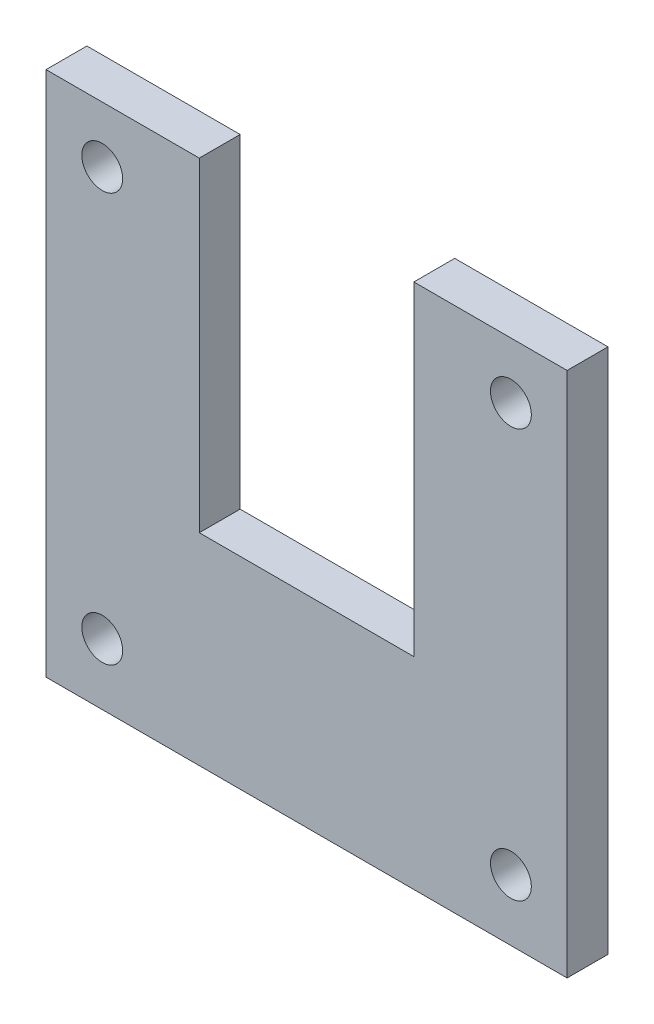
ISO-10303-21;
HEADER;
FILE_DESCRIPTION(('STEP AP214'),'2;1');
FILE_NAME('part.step','',(''),(''),'','','');
FILE_SCHEMA(('AUTOMOTIVE_DESIGN { 1 0 10303 214 1 1 1 1 }'));
ENDSEC;
DATA;
#1=APPLICATION_CONTEXT('core data for automotive mechanical design processes');
#2=APPLICATION_PROTOCOL_DEFINITION('international standard','automotive_design',2000,#1);
#3=PRODUCT_CONTEXT('',#1,'mechanical');
#4=PRODUCT('Part','Part','',(#3));
#5=PRODUCT_RELATED_PRODUCT_CATEGORY('part','',(#4));
#6=PRODUCT_DEFINITION_FORMATION('','',#4);
#7=PRODUCT_DEFINITION_CONTEXT('part definition',#1,'design');
#8=PRODUCT_DEFINITION('design','',#6,#7);
#9=PRODUCT_DEFINITION_SHAPE('','',#8);
#10=(LENGTH_UNIT() NAMED_UNIT(*) SI_UNIT(.MILLI.,.METRE.));
#11=(NAMED_UNIT(*) PLANE_ANGLE_UNIT() SI_UNIT($,.RADIAN.));
#12=(NAMED_UNIT(*) SI_UNIT($,.STERADIAN.) SOLID_ANGLE_UNIT());
#13=UNCERTAINTY_MEASURE_WITH_UNIT(LENGTH_MEASURE(1.E-05),#10,'distance_accuracy_value','');
#14=(GEOMETRIC_REPRESENTATION_CONTEXT(3) GLOBAL_UNCERTAINTY_ASSIGNED_CONTEXT((#13)) GLOBAL_UNIT_ASSIGNED_CONTEXT((#10,
#11,#12)) REPRESENTATION_CONTEXT('',''));
#15=CARTESIAN_POINT('',(0.,0.,0.));
#16=DIRECTION('',(0.,0.,1.));
#17=DIRECTION('',(1.,0.,0.));
#18=AXIS2_PLACEMENT_3D('',#15,#16,#17);
#19=CARTESIAN_POINT('',(-24.2234042553192,19.554868644798,4.));
#20=DIRECTION('',(0.,-1.,0.));
#21=DIRECTION('',(0.,0.,-1.));
#22=AXIS2_PLACEMENT_3D('',#19,#20,#21);
#23=PLANE('',#22);
#24=DIRECTION('',(-1.,0.,0.));
#25=VECTOR('',#24,1.);
#26=CARTESIAN_POINT('',(-24.2234042553192,19.554868644798,4.));
#27=LINE('',#26,#25);
#28=CARTESIAN_POINT('',(-9.22340425531916,19.554868644798,4.));
#29=VERTEX_POINT('',#28);
#30=CARTESIAN_POINT('',(-24.2234042553192,19.554868644798,4.));
#31=VERTEX_POINT('',#30);
#32=EDGE_CURVE('E86',#29,#31,#27,.T.);
#33=ORIENTED_EDGE('',*,*,#32,.F.);
#34=DIRECTION('',(0.,0.,1.));
#35=VECTOR('',#34,1.);
#36=CARTESIAN_POINT('',(-9.22340425531916,19.554868644798,0.));
#37=LINE('',#36,#35);
#38=CARTESIAN_POINT('',(-9.22340425531916,19.554868644798,0.));
#39=VERTEX_POINT('',#38);
#40=EDGE_CURVE('E140',#39,#29,#37,.T.);
#41=ORIENTED_EDGE('',*,*,#40,.F.);
#42=DIRECTION('',(-1.,0.,0.));
#43=VECTOR('',#42,1.);
#44=CARTESIAN_POINT('',(-24.2234042553192,19.554868644798,0.));
#45=LINE('',#44,#43);
#46=CARTESIAN_POINT('',(-24.2234042553192,19.554868644798,0.));
#47=VERTEX_POINT('',#46);
#48=EDGE_CURVE('E132',#39,#47,#45,.T.);
#49=ORIENTED_EDGE('',*,*,#48,.T.);
#50=DIRECTION('',(0.,0.,-1.));
#51=VECTOR('',#50,1.);
#52=CARTESIAN_POINT('',(-24.2234042553192,19.554868644798,4.));
#53=LINE('',#52,#51);
#54=EDGE_CURVE('E11',#31,#47,#53,.T.);
#55=ORIENTED_EDGE('',*,*,#54,.F.);
#56=EDGE_LOOP('',(#33,#41,#49,#55));
#57=FACE_BOUND('',#56,.T.);
#58=ADVANCED_FACE('F35',(#57),#23,.F.);
#59=CARTESIAN_POINT('',(0.,0.,4.));
#60=DIRECTION('',(0.,0.,-1.));
#61=DIRECTION('',(-1.,0.,0.));
#62=AXIS2_PLACEMENT_3D('',#59,#60,#61);
#63=PLANE('',#62);
#64=DIRECTION('',(1.,0.,0.));
#65=VECTOR('',#64,1.);
#66=CARTESIAN_POINT('',(-9.22340425531916,-12.2021276595745,4.));
#67=LINE('',#66,#65);
#68=CARTESIAN_POINT('',(-9.22340425531916,-12.2021276595745,4.));
#69=VERTEX_POINT('',#68);
#70=CARTESIAN_POINT('',(11.7765957446809,-12.2021276595745,4.));
#71=VERTEX_POINT('',#70);
#72=EDGE_CURVE('E134',#69,#71,#67,.T.);
#73=ORIENTED_EDGE('',*,*,#72,.F.);
#74=DIRECTION('',(0.,-1.,0.));
#75=VECTOR('',#74,1.);
#76=CARTESIAN_POINT('',(-9.22340425531916,19.554868644798,4.));
#77=LINE('',#76,#75);
#78=EDGE_CURVE('E114',#29,#69,#77,.T.);
#79=ORIENTED_EDGE('',*,*,#78,.F.);
#80=ORIENTED_EDGE('',*,*,#32,.T.);
#81=DIRECTION('',(0.,-1.,0.));
#82=VECTOR('',#81,1.);
#83=CARTESIAN_POINT('',(-24.2234042553192,19.554868644798,4.));
#84=LINE('',#83,#82);
#85=CARTESIAN_POINT('',(-24.2234042553192,-31.945131355202,4.));
#86=VERTEX_POINT('',#85);
#87=EDGE_CURVE('E171',#31,#86,#84,.T.);
#88=ORIENTED_EDGE('',*,*,#87,.T.);
#89=DIRECTION('',(1.,0.,0.));
#90=VECTOR('',#89,1.);
#91=CARTESIAN_POINT('',(-24.2234042553192,-31.945131355202,4.));
#92=LINE('',#91,#90);
#93=CARTESIAN_POINT('',(26.7765957446808,-31.945131355202,4.));
#94=VERTEX_POINT('',#93);
#95=EDGE_CURVE('E173',#86,#94,#92,.T.);
#96=ORIENTED_EDGE('',*,*,#95,.T.);
#97=DIRECTION('',(0.,1.,0.));
#98=VECTOR('',#97,1.);
#99=CARTESIAN_POINT('',(26.7765957446808,-31.945131355202,4.));
#100=LINE('',#99,#98);
#101=CARTESIAN_POINT('',(26.7765957446808,19.554868644798,4.));
#102=VERTEX_POINT('',#101);
#103=EDGE_CURVE('E59',#94,#102,#100,.T.);
#104=ORIENTED_EDGE('',*,*,#103,.T.);
#105=CARTESIAN_POINT('',(11.7765957446808,19.554868644798,4.));
#106=VERTEX_POINT('',#105);
#107=EDGE_CURVE('E169',#102,#106,#27,.T.);
#108=ORIENTED_EDGE('',*,*,#107,.T.);
#109=DIRECTION('',(0.,1.,0.));
#110=VECTOR('',#109,1.);
#111=CARTESIAN_POINT('',(11.7765957446808,19.554868644798,4.));
#112=LINE('',#111,#110);
#113=EDGE_CURVE('E50',#71,#106,#112,.T.);
#114=ORIENTED_EDGE('',*,*,#113,.F.);
#115=EDGE_LOOP('',(#73,#79,#80,#88,#96,#104,#108,#114));
#116=FACE_BOUND('',#115,.T.);
#117=CARTESIAN_POINT('',(-18.7234042553192,-25.945131355202,4.));
#118=DIRECTION('',(0.,0.,1.));
#119=DIRECTION('',(1.,0.,0.));
#120=AXIS2_PLACEMENT_3D('',#117,#118,#119);
#121=CIRCLE('',#120,2.);
#122=CARTESIAN_POINT('',(-16.7234042553192,-25.945131355202,4.));
#123=VERTEX_POINT('',#122);
#124=EDGE_CURVE('E164',#123,#123,#121,.T.);
#125=ORIENTED_EDGE('',*,*,#124,.F.);
#126=EDGE_LOOP('',(#125));
#127=FACE_BOUND('',#126,.T.);
#128=CARTESIAN_POINT('',(21.2765957446808,-25.945131355202,4.));
#129=DIRECTION('',(0.,0.,1.));
#130=DIRECTION('',(1.,0.,0.));
#131=AXIS2_PLACEMENT_3D('',#128,#129,#130);
#132=CIRCLE('',#131,2.);
#133=CARTESIAN_POINT('',(23.2765957446808,-25.945131355202,4.));
#134=VERTEX_POINT('',#133);
#135=EDGE_CURVE('E158',#134,#134,#132,.T.);
#136=ORIENTED_EDGE('',*,*,#135,.F.);
#137=EDGE_LOOP('',(#136));
#138=FACE_BOUND('',#137,.T.);
#139=CARTESIAN_POINT('',(-18.7234042553192,14.054868644798,4.));
#140=DIRECTION('',(0.,0.,1.));
#141=DIRECTION('',(1.,0.,0.));
#142=AXIS2_PLACEMENT_3D('',#139,#140,#141);
#143=CIRCLE('',#142,2.);
#144=CARTESIAN_POINT('',(-16.7234042553192,14.054868644798,4.));
#145=VERTEX_POINT('',#144);
#146=EDGE_CURVE('E152',#145,#145,#143,.T.);
#147=ORIENTED_EDGE('',*,*,#146,.F.);
#148=EDGE_LOOP('',(#147));
#149=FACE_BOUND('',#148,.T.);
#150=CARTESIAN_POINT('',(21.2765957446808,14.054868644798,4.));
#151=DIRECTION('',(0.,0.,1.));
#152=DIRECTION('',(1.,0.,0.));
#153=AXIS2_PLACEMENT_3D('',#150,#151,#152);
#154=CIRCLE('',#153,2.00000000000001);
#155=CARTESIAN_POINT('',(23.2765957446808,14.054868644798,4.));
#156=VERTEX_POINT('',#155);
#157=EDGE_CURVE('E146',#156,#156,#154,.T.);
#158=ORIENTED_EDGE('',*,*,#157,.F.);
#159=EDGE_LOOP('',(#158));
#160=FACE_BOUND('',#159,.T.);
#161=ADVANCED_FACE('F214',(#116,#127,#138,#149,#160),#63,.F.);
#162=CARTESIAN_POINT('',(0.,0.,0.));
#163=DIRECTION('',(0.,0.,-1.));
#164=DIRECTION('',(-1.,0.,0.));
#165=AXIS2_PLACEMENT_3D('',#162,#163,#164);
#166=PLANE('',#165);
#167=DIRECTION('',(0.,-1.,0.));
#168=VECTOR('',#167,1.);
#169=CARTESIAN_POINT('',(-9.22340425531916,19.554868644798,0.));
#170=LINE('',#169,#168);
#171=CARTESIAN_POINT('',(-9.22340425531916,-12.2021276595745,0.));
#172=VERTEX_POINT('',#171);
#173=EDGE_CURVE('E112',#39,#172,#170,.T.);
#174=ORIENTED_EDGE('',*,*,#173,.T.);
#175=DIRECTION('',(1.,0.,0.));
#176=VECTOR('',#175,1.);
#177=CARTESIAN_POINT('',(-9.22340425531916,-12.2021276595745,0.));
#178=LINE('',#177,#176);
#179=CARTESIAN_POINT('',(11.7765957446809,-12.2021276595745,0.));
#180=VERTEX_POINT('',#179);
#181=EDGE_CURVE('E122',#172,#180,#178,.T.);
#182=ORIENTED_EDGE('',*,*,#181,.T.);
#183=DIRECTION('',(0.,1.,0.));
#184=VECTOR('',#183,1.);
#185=CARTESIAN_POINT('',(11.7765957446808,19.554868644798,0.));
#186=LINE('',#185,#184);
#187=CARTESIAN_POINT('',(11.7765957446808,19.554868644798,0.));
#188=VERTEX_POINT('',#187);
#189=EDGE_CURVE('E119',#180,#188,#186,.T.);
#190=ORIENTED_EDGE('',*,*,#189,.T.);
#191=CARTESIAN_POINT('',(26.7765957446808,19.554868644798,0.));
#192=VERTEX_POINT('',#191);
#193=EDGE_CURVE('E177',#192,#188,#45,.T.);
#194=ORIENTED_EDGE('',*,*,#193,.F.);
#195=DIRECTION('',(0.,1.,0.));
#196=VECTOR('',#195,1.);
#197=CARTESIAN_POINT('',(26.7765957446808,19.554868644798,0.));
#198=LINE('',#197,#196);
#199=CARTESIAN_POINT('',(26.7765957446808,-31.945131355202,0.));
#200=VERTEX_POINT('',#199);
#201=EDGE_CURVE('E79',#200,#192,#198,.T.);
#202=ORIENTED_EDGE('',*,*,#201,.F.);
#203=DIRECTION('',(1.,0.,0.));
#204=VECTOR('',#203,1.);
#205=CARTESIAN_POINT('',(-24.2234042553192,-31.945131355202,0.));
#206=LINE('',#205,#204);
#207=CARTESIAN_POINT('',(-24.2234042553192,-31.945131355202,0.));
#208=VERTEX_POINT('',#207);
#209=EDGE_CURVE('E182',#208,#200,#206,.T.);
#210=ORIENTED_EDGE('',*,*,#209,.F.);
#211=DIRECTION('',(0.,-1.,0.));
#212=VECTOR('',#211,1.);
#213=CARTESIAN_POINT('',(-24.2234042553192,-31.445131355202,0.));
#214=LINE('',#213,#212);
#215=EDGE_CURVE('E180',#47,#208,#214,.T.);
#216=ORIENTED_EDGE('',*,*,#215,.F.);
#217=ORIENTED_EDGE('',*,*,#48,.F.);
#218=EDGE_LOOP('',(#174,#182,#190,#194,#202,#210,#216,#217));
#219=FACE_BOUND('',#218,.T.);
#220=CARTESIAN_POINT('',(-18.7234042553192,14.054868644798,0.));
#221=DIRECTION('',(0.,0.,1.));
#222=DIRECTION('',(1.,0.,0.));
#223=AXIS2_PLACEMENT_3D('',#220,#221,#222);
#224=CIRCLE('',#223,2.);
#225=CARTESIAN_POINT('',(-16.7234042553192,14.054868644798,0.));
#226=VERTEX_POINT('',#225);
#227=EDGE_CURVE('E149',#226,#226,#224,.T.);
#228=ORIENTED_EDGE('',*,*,#227,.T.);
#229=EDGE_LOOP('',(#228));
#230=FACE_BOUND('',#229,.T.);
#231=CARTESIAN_POINT('',(-18.7234042553192,-25.945131355202,0.));
#232=DIRECTION('',(0.,0.,1.));
#233=DIRECTION('',(1.,0.,0.));
#234=AXIS2_PLACEMENT_3D('',#231,#232,#233);
#235=CIRCLE('',#234,2.);
#236=CARTESIAN_POINT('',(-16.7234042553192,-25.945131355202,0.));
#237=VERTEX_POINT('',#236);
#238=EDGE_CURVE('E161',#237,#237,#235,.T.);
#239=ORIENTED_EDGE('',*,*,#238,.T.);
#240=EDGE_LOOP('',(#239));
#241=FACE_BOUND('',#240,.T.);
#242=CARTESIAN_POINT('',(21.2765957446808,-25.945131355202,0.));
#243=DIRECTION('',(0.,0.,1.));
#244=DIRECTION('',(1.,0.,0.));
#245=AXIS2_PLACEMENT_3D('',#242,#243,#244);
#246=CIRCLE('',#245,2.);
#247=CARTESIAN_POINT('',(23.2765957446808,-25.945131355202,0.));
#248=VERTEX_POINT('',#247);
#249=EDGE_CURVE('E155',#248,#248,#246,.T.);
#250=ORIENTED_EDGE('',*,*,#249,.T.);
#251=EDGE_LOOP('',(#250));
#252=FACE_BOUND('',#251,.T.);
#253=CARTESIAN_POINT('',(21.2765957446808,14.054868644798,0.));
#254=DIRECTION('',(0.,0.,1.));
#255=DIRECTION('',(1.,0.,0.));
#256=AXIS2_PLACEMENT_3D('',#253,#254,#255);
#257=CIRCLE('',#256,2.00000000000001);
#258=CARTESIAN_POINT('',(23.2765957446808,14.054868644798,0.));
#259=VERTEX_POINT('',#258);
#260=EDGE_CURVE('E142',#259,#259,#257,.T.);
#261=ORIENTED_EDGE('',*,*,#260,.T.);
#262=EDGE_LOOP('',(#261));
#263=FACE_BOUND('',#262,.T.);
#264=ADVANCED_FACE('F129',(#219,#230,#241,#252,#263),#166,.T.);
#265=ORIENTED_EDGE('',*,*,#193,.T.);
#266=DIRECTION('',(0.,0.,1.));
#267=VECTOR('',#266,1.);
#268=CARTESIAN_POINT('',(11.7765957446808,19.554868644798,0.));
#269=LINE('',#268,#267);
#270=EDGE_CURVE('E143',#188,#106,#269,.T.);
#271=ORIENTED_EDGE('',*,*,#270,.T.);
#272=ORIENTED_EDGE('',*,*,#107,.F.);
#273=DIRECTION('',(0.,0.,-1.));
#274=VECTOR('',#273,1.);
#275=CARTESIAN_POINT('',(26.7765957446808,19.554868644798,4.));
#276=LINE('',#275,#274);
#277=EDGE_CURVE('E176',#102,#192,#276,.T.);
#278=ORIENTED_EDGE('',*,*,#277,.T.);
#279=EDGE_LOOP('',(#265,#271,#272,#278));
#280=FACE_BOUND('',#279,.T.);
#281=ADVANCED_FACE('F37',(#280),#23,.F.);
#282=CARTESIAN_POINT('',(-24.2234042553192,-31.445131355202,4.));
#283=DIRECTION('',(1.,0.,0.));
#284=DIRECTION('',(0.,0.,-1.));
#285=AXIS2_PLACEMENT_3D('',#282,#283,#284);
#286=PLANE('',#285);
#287=ORIENTED_EDGE('',*,*,#215,.T.);
#288=DIRECTION('',(0.,0.,-1.));
#289=VECTOR('',#288,1.);
#290=CARTESIAN_POINT('',(-24.2234042553192,-31.945131355202,4.));
#291=LINE('',#290,#289);
#292=EDGE_CURVE('E43',#86,#208,#291,.T.);
#293=ORIENTED_EDGE('',*,*,#292,.F.);
#294=ORIENTED_EDGE('',*,*,#87,.F.);
#295=ORIENTED_EDGE('',*,*,#54,.T.);
#296=EDGE_LOOP('',(#287,#293,#294,#295));
#297=FACE_BOUND('',#296,.T.);
#298=ADVANCED_FACE('F210',(#297),#286,.F.);
#299=CARTESIAN_POINT('',(-24.2234042553192,-31.945131355202,4.));
#300=DIRECTION('',(0.,1.,0.));
#301=DIRECTION('',(0.,0.,1.));
#302=AXIS2_PLACEMENT_3D('',#299,#300,#301);
#303=PLANE('',#302);
#304=ORIENTED_EDGE('',*,*,#209,.T.);
#305=DIRECTION('',(0.,0.,-1.));
#306=VECTOR('',#305,1.);
#307=CARTESIAN_POINT('',(26.7765957446808,-31.945131355202,4.));
#308=LINE('',#307,#306);
#309=EDGE_CURVE('E187',#94,#200,#308,.T.);
#310=ORIENTED_EDGE('',*,*,#309,.F.);
#311=ORIENTED_EDGE('',*,*,#95,.F.);
#312=ORIENTED_EDGE('',*,*,#292,.T.);
#313=EDGE_LOOP('',(#304,#310,#311,#312));
#314=FACE_BOUND('',#313,.T.);
#315=ADVANCED_FACE('F193',(#314),#303,.F.);
#316=CARTESIAN_POINT('',(26.7765957446808,19.554868644798,4.));
#317=DIRECTION('',(-1.,0.,0.));
#318=DIRECTION('',(0.,-1.,0.));
#319=AXIS2_PLACEMENT_3D('',#316,#317,#318);
#320=PLANE('',#319);
#321=ORIENTED_EDGE('',*,*,#201,.T.);
#322=ORIENTED_EDGE('',*,*,#277,.F.);
#323=ORIENTED_EDGE('',*,*,#103,.F.);
#324=ORIENTED_EDGE('',*,*,#309,.T.);
#325=EDGE_LOOP('',(#321,#322,#323,#324));
#326=FACE_BOUND('',#325,.T.);
#327=ADVANCED_FACE('F199',(#326),#320,.F.);
#328=CARTESIAN_POINT('',(-18.7234042553192,-25.945131355202,4.));
#329=DIRECTION('',(0.,0.,-1.));
#330=DIRECTION('',(-1.,0.,0.));
#331=AXIS2_PLACEMENT_3D('',#328,#329,#330);
#332=CYLINDRICAL_SURFACE('',#331,2.);
#333=ORIENTED_EDGE('',*,*,#124,.T.);
#334=EDGE_LOOP('',(#333));
#335=FACE_BOUND('',#334,.T.);
#336=ORIENTED_EDGE('',*,*,#238,.F.);
#337=EDGE_LOOP('',(#336));
#338=FACE_BOUND('',#337,.T.);
#339=ADVANCED_FACE('F201',(#335,#338),#332,.F.);
#340=CARTESIAN_POINT('',(21.2765957446808,-25.945131355202,4.));
#341=DIRECTION('',(0.,0.,-1.));
#342=DIRECTION('',(-1.,0.,0.));
#343=AXIS2_PLACEMENT_3D('',#340,#341,#342);
#344=CYLINDRICAL_SURFACE('',#343,2.);
#345=ORIENTED_EDGE('',*,*,#135,.T.);
#346=EDGE_LOOP('',(#345));
#347=FACE_BOUND('',#346,.T.);
#348=ORIENTED_EDGE('',*,*,#249,.F.);
#349=EDGE_LOOP('',(#348));
#350=FACE_BOUND('',#349,.T.);
#351=ADVANCED_FACE('F207',(#347,#350),#344,.F.);
#352=CARTESIAN_POINT('',(-18.7234042553192,14.054868644798,4.));
#353=DIRECTION('',(0.,0.,-1.));
#354=DIRECTION('',(-1.,0.,0.));
#355=AXIS2_PLACEMENT_3D('',#352,#353,#354);
#356=CYLINDRICAL_SURFACE('',#355,2.);
#357=ORIENTED_EDGE('',*,*,#146,.T.);
#358=EDGE_LOOP('',(#357));
#359=FACE_BOUND('',#358,.T.);
#360=ORIENTED_EDGE('',*,*,#227,.F.);
#361=EDGE_LOOP('',(#360));
#362=FACE_BOUND('',#361,.T.);
#363=ADVANCED_FACE('F230',(#359,#362),#356,.F.);
#364=CARTESIAN_POINT('',(21.2765957446808,14.054868644798,4.));
#365=DIRECTION('',(0.,0.,-1.));
#366=DIRECTION('',(-1.,0.,0.));
#367=AXIS2_PLACEMENT_3D('',#364,#365,#366);
#368=CYLINDRICAL_SURFACE('',#367,2.00000000000001);
#369=ORIENTED_EDGE('',*,*,#157,.T.);
#370=EDGE_LOOP('',(#369));
#371=FACE_BOUND('',#370,.T.);
#372=ORIENTED_EDGE('',*,*,#260,.F.);
#373=EDGE_LOOP('',(#372));
#374=FACE_BOUND('',#373,.T.);
#375=ADVANCED_FACE('F234',(#371,#374),#368,.F.);
#376=CARTESIAN_POINT('',(-9.22340425531916,19.554868644798,0.));
#377=DIRECTION('',(-1.,0.,0.));
#378=DIRECTION('',(0.,-1.,0.));
#379=AXIS2_PLACEMENT_3D('',#376,#377,#378);
#380=PLANE('',#379);
#381=ORIENTED_EDGE('',*,*,#78,.T.);
#382=DIRECTION('',(0.,0.,1.));
#383=VECTOR('',#382,1.);
#384=CARTESIAN_POINT('',(-9.22340425531916,-12.2021276595745,0.));
#385=LINE('',#384,#383);
#386=EDGE_CURVE('E108',#172,#69,#385,.T.);
#387=ORIENTED_EDGE('',*,*,#386,.F.);
#388=ORIENTED_EDGE('',*,*,#173,.F.);
#389=ORIENTED_EDGE('',*,*,#40,.T.);
#390=EDGE_LOOP('',(#381,#387,#388,#389));
#391=FACE_BOUND('',#390,.T.);
#392=ADVANCED_FACE('F110',(#391),#380,.F.);
#393=CARTESIAN_POINT('',(11.7765957446808,19.554868644798,0.));
#394=DIRECTION('',(1.,0.,0.));
#395=DIRECTION('',(0.,1.,0.));
#396=AXIS2_PLACEMENT_3D('',#393,#394,#395);
#397=PLANE('',#396);
#398=ORIENTED_EDGE('',*,*,#113,.T.);
#399=ORIENTED_EDGE('',*,*,#270,.F.);
#400=ORIENTED_EDGE('',*,*,#189,.F.);
#401=DIRECTION('',(0.,0.,1.));
#402=VECTOR('',#401,1.);
#403=CARTESIAN_POINT('',(11.7765957446809,-12.2021276595745,0.));
#404=LINE('',#403,#402);
#405=EDGE_CURVE('E118',#180,#71,#404,.T.);
#406=ORIENTED_EDGE('',*,*,#405,.T.);
#407=EDGE_LOOP('',(#398,#399,#400,#406));
#408=FACE_BOUND('',#407,.T.);
#409=ADVANCED_FACE('F241',(#408),#397,.F.);
#410=CARTESIAN_POINT('',(-9.22340425531916,-12.2021276595745,0.));
#411=DIRECTION('',(0.,-1.,0.));
#412=DIRECTION('',(0.,0.,-1.));
#413=AXIS2_PLACEMENT_3D('',#410,#411,#412);
#414=PLANE('',#413);
#415=ORIENTED_EDGE('',*,*,#72,.T.);
#416=ORIENTED_EDGE('',*,*,#405,.F.);
#417=ORIENTED_EDGE('',*,*,#181,.F.);
#418=ORIENTED_EDGE('',*,*,#386,.T.);
#419=EDGE_LOOP('',(#415,#416,#417,#418));
#420=FACE_BOUND('',#419,.T.);
#421=ADVANCED_FACE('F123',(#420),#414,.F.);
#422=CLOSED_SHELL('',(#58,#161,#264,#281,#298,#315,#327,#339,#351,#363,#375,#392,#409,#421));
#423=MANIFOLD_SOLID_BREP('B2',#422);
#424=ADVANCED_BREP_SHAPE_REPRESENTATION('',(#18,#423),#14);
#425=SHAPE_DEFINITION_REPRESENTATION(#9,#424);
ENDSEC;
END-ISO-10303-21;
